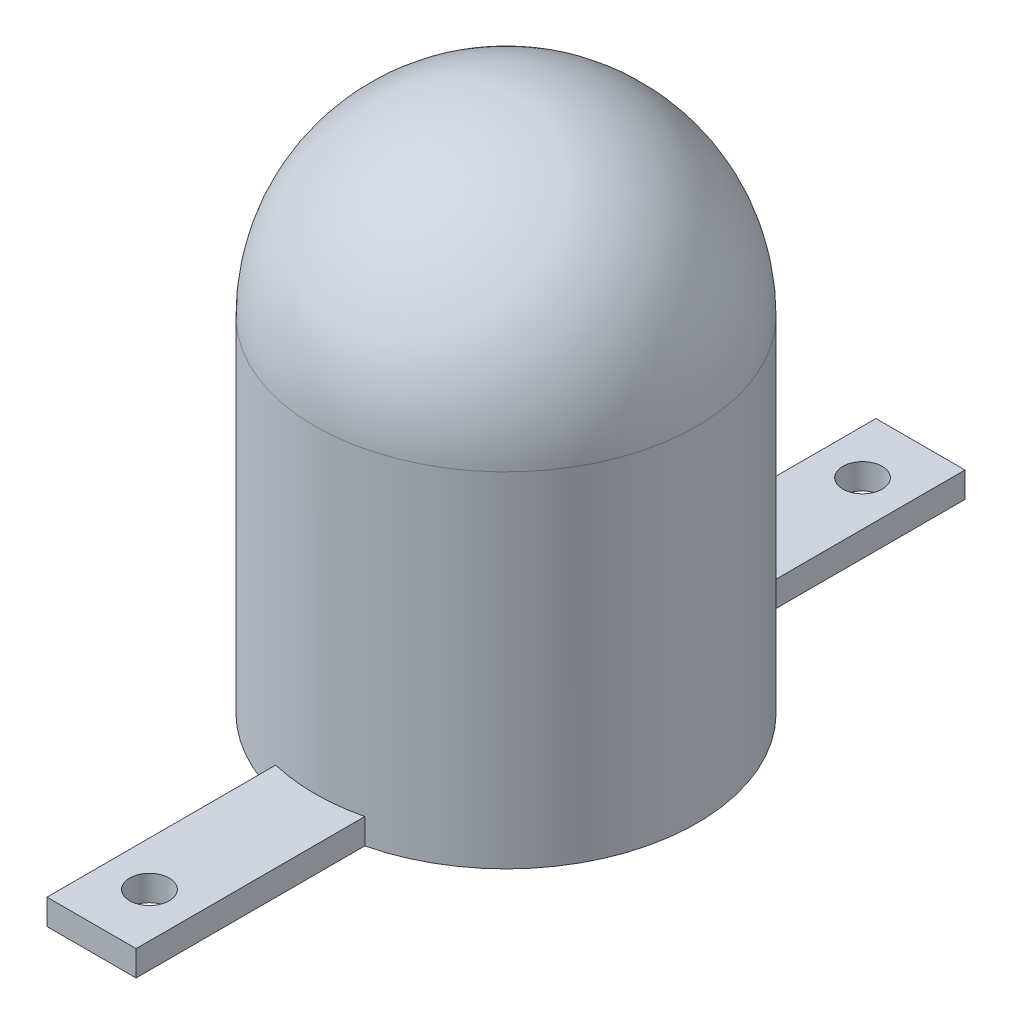
ISO-10303-21;
HEADER;
FILE_DESCRIPTION(('STEP AP214'),'2;1');
FILE_NAME('part.step','',(''),(''),'','','');
FILE_SCHEMA(('AUTOMOTIVE_DESIGN { 1 0 10303 214 1 1 1 1 }'));
ENDSEC;
DATA;
#1=APPLICATION_CONTEXT('core data for automotive mechanical design processes');
#2=APPLICATION_PROTOCOL_DEFINITION('international standard','automotive_design',2000,#1);
#3=PRODUCT_CONTEXT('',#1,'mechanical');
#4=PRODUCT('Part','Part','',(#3));
#5=PRODUCT_RELATED_PRODUCT_CATEGORY('part','',(#4));
#6=PRODUCT_DEFINITION_FORMATION('','',#4);
#7=PRODUCT_DEFINITION_CONTEXT('part definition',#1,'design');
#8=PRODUCT_DEFINITION('design','',#6,#7);
#9=PRODUCT_DEFINITION_SHAPE('','',#8);
#10=(LENGTH_UNIT() NAMED_UNIT(*) SI_UNIT(.MILLI.,.METRE.));
#11=(NAMED_UNIT(*) PLANE_ANGLE_UNIT() SI_UNIT($,.RADIAN.));
#12=(NAMED_UNIT(*) SI_UNIT($,.STERADIAN.) SOLID_ANGLE_UNIT());
#13=UNCERTAINTY_MEASURE_WITH_UNIT(LENGTH_MEASURE(1.E-05),#10,'distance_accuracy_value','');
#14=(GEOMETRIC_REPRESENTATION_CONTEXT(3) GLOBAL_UNCERTAINTY_ASSIGNED_CONTEXT((#13)) GLOBAL_UNIT_ASSIGNED_CONTEXT((#10,
#11,#12)) REPRESENTATION_CONTEXT('',''));
#15=CARTESIAN_POINT('',(0.,0.,0.));
#16=DIRECTION('',(0.,0.,1.));
#17=DIRECTION('',(1.,0.,0.));
#18=AXIS2_PLACEMENT_3D('',#15,#16,#17);
#19=CARTESIAN_POINT('',(-3.50000000000001,2.,-32.55));
#20=DIRECTION('',(1.,0.,0.));
#21=DIRECTION('',(0.,0.,-1.));
#22=AXIS2_PLACEMENT_3D('',#19,#20,#21);
#23=PLANE('',#22);
#24=DIRECTION('',(0.,1.,0.));
#25=VECTOR('',#24,1.);
#26=CARTESIAN_POINT('',(-3.5,-1.04083408558608E-13,-14.5859521458149));
#27=LINE('',#26,#25);
#28=CARTESIAN_POINT('',(-3.5,2.,-14.5859521458149));
#29=VERTEX_POINT('',#28);
#30=CARTESIAN_POINT('',(-3.5,-1.2852377793051E-13,-14.5859521458149));
#31=VERTEX_POINT('',#30);
#32=EDGE_CURVE('E150',#29,#31,#27,.F.);
#33=ORIENTED_EDGE('',*,*,#32,.F.);
#34=DIRECTION('',(0.,0.,1.));
#35=VECTOR('',#34,1.);
#36=CARTESIAN_POINT('',(-3.50000000000001,2.,-32.55));
#37=LINE('',#36,#35);
#38=CARTESIAN_POINT('',(-3.50000000000001,2.,-32.55));
#39=VERTEX_POINT('',#38);
#40=EDGE_CURVE('E158',#39,#29,#37,.T.);
#41=ORIENTED_EDGE('',*,*,#40,.F.);
#42=DIRECTION('',(0.,-1.,0.));
#43=VECTOR('',#42,1.);
#44=CARTESIAN_POINT('',(-3.50000000000001,2.,-32.55));
#45=LINE('',#44,#43);
#46=CARTESIAN_POINT('',(-3.50000000000001,0.,-32.55));
#47=VERTEX_POINT('',#46);
#48=EDGE_CURVE('E136',#39,#47,#45,.T.);
#49=ORIENTED_EDGE('',*,*,#48,.T.);
#50=DIRECTION('',(0.,0.,1.));
#51=VECTOR('',#50,1.);
#52=CARTESIAN_POINT('',(-3.50000000000001,0.,-32.55));
#53=LINE('',#52,#51);
#54=EDGE_CURVE('E146',#47,#31,#53,.T.);
#55=ORIENTED_EDGE('',*,*,#54,.T.);
#56=EDGE_LOOP('',(#33,#41,#49,#55));
#57=FACE_BOUND('',#56,.T.);
#58=ADVANCED_FACE('F33',(#57),#23,.F.);
#59=DIRECTION('',(0.,1.,0.));
#60=VECTOR('',#59,1.);
#61=CARTESIAN_POINT('',(-3.5,-1.04083408558608E-13,14.5859521458149));
#62=LINE('',#61,#60);
#63=CARTESIAN_POINT('',(-3.5,-1.2852377793051E-13,14.5859521458149));
#64=VERTEX_POINT('',#63);
#65=CARTESIAN_POINT('',(-3.5,2.,14.5859521458149));
#66=VERTEX_POINT('',#65);
#67=EDGE_CURVE('E47',#64,#66,#62,.T.);
#68=ORIENTED_EDGE('',*,*,#67,.F.);
#69=CARTESIAN_POINT('',(-3.5,0.,32.55));
#70=VERTEX_POINT('',#69);
#71=EDGE_CURVE('E149',#64,#70,#53,.T.);
#72=ORIENTED_EDGE('',*,*,#71,.T.);
#73=DIRECTION('',(0.,-1.,0.));
#74=VECTOR('',#73,1.);
#75=CARTESIAN_POINT('',(-3.5,2.,32.55));
#76=LINE('',#75,#74);
#77=CARTESIAN_POINT('',(-3.5,2.,32.55));
#78=VERTEX_POINT('',#77);
#79=EDGE_CURVE('E11',#78,#70,#76,.T.);
#80=ORIENTED_EDGE('',*,*,#79,.F.);
#81=EDGE_CURVE('E84',#66,#78,#37,.T.);
#82=ORIENTED_EDGE('',*,*,#81,.F.);
#83=EDGE_LOOP('',(#68,#72,#80,#82));
#84=FACE_BOUND('',#83,.T.);
#85=ADVANCED_FACE('F202',(#84),#23,.F.);
#86=CARTESIAN_POINT('',(3.49999999999999,2.,-32.55));
#87=DIRECTION('',(-1.,0.,0.));
#88=DIRECTION('',(0.,0.,1.));
#89=AXIS2_PLACEMENT_3D('',#86,#87,#88);
#90=PLANE('',#89);
#91=DIRECTION('',(0.,1.,0.));
#92=VECTOR('',#91,1.);
#93=CARTESIAN_POINT('',(3.5,-1.04083408558608E-13,14.5859521458149));
#94=LINE('',#93,#92);
#95=CARTESIAN_POINT('',(3.5,2.,14.5859521458149));
#96=VERTEX_POINT('',#95);
#97=CARTESIAN_POINT('',(3.5,0.,14.5859521458149));
#98=VERTEX_POINT('',#97);
#99=EDGE_CURVE('E105',#96,#98,#94,.F.);
#100=ORIENTED_EDGE('',*,*,#99,.F.);
#101=DIRECTION('',(0.,0.,-1.));
#102=VECTOR('',#101,1.);
#103=CARTESIAN_POINT('',(3.49999999999999,2.,-32.55));
#104=LINE('',#103,#102);
#105=CARTESIAN_POINT('',(3.5,2.,32.55));
#106=VERTEX_POINT('',#105);
#107=EDGE_CURVE('E153',#106,#96,#104,.T.);
#108=ORIENTED_EDGE('',*,*,#107,.F.);
#109=DIRECTION('',(0.,-1.,0.));
#110=VECTOR('',#109,1.);
#111=CARTESIAN_POINT('',(3.5,2.,32.55));
#112=LINE('',#111,#110);
#113=CARTESIAN_POINT('',(3.5,0.,32.55));
#114=VERTEX_POINT('',#113);
#115=EDGE_CURVE('E40',#106,#114,#112,.T.);
#116=ORIENTED_EDGE('',*,*,#115,.T.);
#117=DIRECTION('',(0.,0.,-1.));
#118=VECTOR('',#117,1.);
#119=CARTESIAN_POINT('',(3.49999999999999,0.,-32.55));
#120=LINE('',#119,#118);
#121=EDGE_CURVE('E122',#114,#98,#120,.T.);
#122=ORIENTED_EDGE('',*,*,#121,.T.);
#123=EDGE_LOOP('',(#100,#108,#116,#122));
#124=FACE_BOUND('',#123,.T.);
#125=ADVANCED_FACE('F128',(#124),#90,.F.);
#126=DIRECTION('',(0.,1.,0.));
#127=VECTOR('',#126,1.);
#128=CARTESIAN_POINT('',(3.5,-1.04083408558608E-13,-14.5859521458149));
#129=LINE('',#128,#127);
#130=CARTESIAN_POINT('',(3.5,0.,-14.5859521458149));
#131=VERTEX_POINT('',#130);
#132=CARTESIAN_POINT('',(3.5,2.,-14.5859521458149));
#133=VERTEX_POINT('',#132);
#134=EDGE_CURVE('E161',#131,#133,#129,.T.);
#135=ORIENTED_EDGE('',*,*,#134,.F.);
#136=CARTESIAN_POINT('',(3.49999999999999,0.,-32.55));
#137=VERTEX_POINT('',#136);
#138=EDGE_CURVE('E123',#131,#137,#120,.T.);
#139=ORIENTED_EDGE('',*,*,#138,.T.);
#140=DIRECTION('',(0.,-1.,0.));
#141=VECTOR('',#140,1.);
#142=CARTESIAN_POINT('',(3.49999999999999,2.,-32.55));
#143=LINE('',#142,#141);
#144=CARTESIAN_POINT('',(3.49999999999999,2.,-32.55));
#145=VERTEX_POINT('',#144);
#146=EDGE_CURVE('E138',#145,#137,#143,.T.);
#147=ORIENTED_EDGE('',*,*,#146,.F.);
#148=EDGE_CURVE('E155',#133,#145,#104,.T.);
#149=ORIENTED_EDGE('',*,*,#148,.F.);
#150=EDGE_LOOP('',(#135,#139,#147,#149));
#151=FACE_BOUND('',#150,.T.);
#152=ADVANCED_FACE('F193',(#151),#90,.F.);
#153=CARTESIAN_POINT('',(0.,2.,0.));
#154=DIRECTION('',(0.,1.,0.));
#155=DIRECTION('',(0.,0.,1.));
#156=AXIS2_PLACEMENT_3D('',#153,#154,#155);
#157=PLANE('',#156);
#158=CARTESIAN_POINT('',(0.,2.,-28.));
#159=DIRECTION('',(0.,1.,0.));
#160=DIRECTION('',(0.,0.,-1.));
#161=AXIS2_PLACEMENT_3D('',#158,#159,#160);
#162=CIRCLE('',#161,1.55);
#163=CARTESIAN_POINT('',(0.,2.,-29.55));
#164=VERTEX_POINT('',#163);
#165=EDGE_CURVE('E175',#164,#164,#162,.T.);
#166=ORIENTED_EDGE('',*,*,#165,.F.);
#167=EDGE_LOOP('',(#166));
#168=FACE_BOUND('',#167,.T.);
#169=ORIENTED_EDGE('',*,*,#40,.T.);
#170=CARTESIAN_POINT('',(0.,2.,0.));
#171=DIRECTION('',(0.,1.,0.));
#172=DIRECTION('',(0.,0.,1.));
#173=AXIS2_PLACEMENT_3D('',#170,#171,#172);
#174=CIRCLE('',#173,15.0000000000001);
#175=EDGE_CURVE('E163',#29,#133,#174,.F.);
#176=ORIENTED_EDGE('',*,*,#175,.T.);
#177=ORIENTED_EDGE('',*,*,#148,.T.);
#178=DIRECTION('',(-1.,0.,0.));
#179=VECTOR('',#178,1.);
#180=CARTESIAN_POINT('',(-3.50000000000001,2.,-32.55));
#181=LINE('',#180,#179);
#182=EDGE_CURVE('E56',#145,#39,#181,.T.);
#183=ORIENTED_EDGE('',*,*,#182,.T.);
#184=EDGE_LOOP('',(#169,#176,#177,#183));
#185=FACE_BOUND('',#184,.T.);
#186=ADVANCED_FACE('F190',(#168,#185),#157,.T.);
#187=CARTESIAN_POINT('',(0.,2.,28.));
#188=DIRECTION('',(0.,1.,0.));
#189=DIRECTION('',(0.,0.,1.));
#190=AXIS2_PLACEMENT_3D('',#187,#188,#189);
#191=CIRCLE('',#190,1.55);
#192=CARTESIAN_POINT('',(0.,2.,29.55));
#193=VERTEX_POINT('',#192);
#194=EDGE_CURVE('E169',#193,#193,#191,.T.);
#195=ORIENTED_EDGE('',*,*,#194,.F.);
#196=EDGE_LOOP('',(#195));
#197=FACE_BOUND('',#196,.T.);
#198=ORIENTED_EDGE('',*,*,#107,.T.);
#199=EDGE_CURVE('E110',#96,#66,#174,.F.);
#200=ORIENTED_EDGE('',*,*,#199,.T.);
#201=ORIENTED_EDGE('',*,*,#81,.T.);
#202=DIRECTION('',(1.,0.,0.));
#203=VECTOR('',#202,1.);
#204=CARTESIAN_POINT('',(-3.5,2.,32.55));
#205=LINE('',#204,#203);
#206=EDGE_CURVE('E156',#78,#106,#205,.T.);
#207=ORIENTED_EDGE('',*,*,#206,.T.);
#208=EDGE_LOOP('',(#198,#200,#201,#207));
#209=FACE_BOUND('',#208,.T.);
#210=ADVANCED_FACE('F192',(#197,#209),#157,.T.);
#211=CARTESIAN_POINT('',(-3.5,2.,32.55));
#212=DIRECTION('',(0.,0.,-1.));
#213=DIRECTION('',(-1.,0.,0.));
#214=AXIS2_PLACEMENT_3D('',#211,#212,#213);
#215=PLANE('',#214);
#216=DIRECTION('',(1.,0.,0.));
#217=VECTOR('',#216,1.);
#218=CARTESIAN_POINT('',(-3.5,0.,32.55));
#219=LINE('',#218,#217);
#220=EDGE_CURVE('E132',#70,#114,#219,.T.);
#221=ORIENTED_EDGE('',*,*,#220,.T.);
#222=ORIENTED_EDGE('',*,*,#115,.F.);
#223=ORIENTED_EDGE('',*,*,#206,.F.);
#224=ORIENTED_EDGE('',*,*,#79,.T.);
#225=EDGE_LOOP('',(#221,#222,#223,#224));
#226=FACE_BOUND('',#225,.T.);
#227=ADVANCED_FACE('F213',(#226),#215,.F.);
#228=CARTESIAN_POINT('',(-3.50000000000001,2.,-32.55));
#229=DIRECTION('',(0.,0.,1.));
#230=DIRECTION('',(1.,0.,0.));
#231=AXIS2_PLACEMENT_3D('',#228,#229,#230);
#232=PLANE('',#231);
#233=DIRECTION('',(-1.,0.,0.));
#234=VECTOR('',#233,1.);
#235=CARTESIAN_POINT('',(-3.50000000000001,0.,-32.55));
#236=LINE('',#235,#234);
#237=EDGE_CURVE('E77',#137,#47,#236,.T.);
#238=ORIENTED_EDGE('',*,*,#237,.T.);
#239=ORIENTED_EDGE('',*,*,#48,.F.);
#240=ORIENTED_EDGE('',*,*,#182,.F.);
#241=ORIENTED_EDGE('',*,*,#146,.T.);
#242=EDGE_LOOP('',(#238,#239,#240,#241));
#243=FACE_BOUND('',#242,.T.);
#244=ADVANCED_FACE('F140',(#243),#232,.F.);
#245=CARTESIAN_POINT('',(0.,0.,0.));
#246=DIRECTION('',(0.,1.,0.));
#247=DIRECTION('',(0.,0.,1.));
#248=AXIS2_PLACEMENT_3D('',#245,#246,#247);
#249=PLANE('',#248);
#250=CARTESIAN_POINT('',(0.,0.,-28.));
#251=DIRECTION('',(0.,1.,0.));
#252=DIRECTION('',(0.,0.,-1.));
#253=AXIS2_PLACEMENT_3D('',#250,#251,#252);
#254=CIRCLE('',#253,1.55);
#255=CARTESIAN_POINT('',(0.,0.,-29.55));
#256=VERTEX_POINT('',#255);
#257=EDGE_CURVE('E172',#256,#256,#254,.T.);
#258=ORIENTED_EDGE('',*,*,#257,.T.);
#259=EDGE_LOOP('',(#258));
#260=FACE_BOUND('',#259,.T.);
#261=CARTESIAN_POINT('',(0.,0.,28.));
#262=DIRECTION('',(0.,1.,0.));
#263=DIRECTION('',(0.,0.,1.));
#264=AXIS2_PLACEMENT_3D('',#261,#262,#263);
#265=CIRCLE('',#264,1.55);
#266=CARTESIAN_POINT('',(0.,0.,29.55));
#267=VERTEX_POINT('',#266);
#268=EDGE_CURVE('E168',#267,#267,#265,.T.);
#269=ORIENTED_EDGE('',*,*,#268,.T.);
#270=EDGE_LOOP('',(#269));
#271=FACE_BOUND('',#270,.T.);
#272=ORIENTED_EDGE('',*,*,#71,.F.);
#273=CARTESIAN_POINT('',(0.,-1.04083408558608E-13,0.));
#274=DIRECTION('',(0.,-1.,0.));
#275=DIRECTION('',(1.,0.,0.));
#276=AXIS2_PLACEMENT_3D('',#273,#274,#275);
#277=CIRCLE('',#276,15.0000000000001);
#278=EDGE_CURVE('E124',#64,#31,#277,.T.);
#279=ORIENTED_EDGE('',*,*,#278,.T.);
#280=ORIENTED_EDGE('',*,*,#54,.F.);
#281=ORIENTED_EDGE('',*,*,#237,.F.);
#282=ORIENTED_EDGE('',*,*,#138,.F.);
#283=EDGE_CURVE('E108',#131,#98,#277,.T.);
#284=ORIENTED_EDGE('',*,*,#283,.T.);
#285=ORIENTED_EDGE('',*,*,#121,.F.);
#286=ORIENTED_EDGE('',*,*,#220,.F.);
#287=EDGE_LOOP('',(#272,#279,#280,#281,#282,#284,#285,#286));
#288=FACE_BOUND('',#287,.T.);
#289=ADVANCED_FACE('F120',(#260,#271,#288),#249,.F.);
#290=CARTESIAN_POINT('',(0.,-1.04083408558608E-13,0.));
#291=DIRECTION('',(0.,1.,0.));
#292=DIRECTION('',(-1.,0.,0.));
#293=AXIS2_PLACEMENT_3D('',#290,#291,#292);
#294=CYLINDRICAL_SURFACE('',#293,15.0000000000001);
#295=CARTESIAN_POINT('',(0.,27.,0.));
#296=DIRECTION('',(0.,-1.,0.));
#297=DIRECTION('',(0.,0.,1.));
#298=AXIS2_PLACEMENT_3D('',#295,#296,#297);
#299=CIRCLE('',#298,15.);
#300=CARTESIAN_POINT('',(0.,27.,15.));
#301=VERTEX_POINT('',#300);
#302=EDGE_CURVE('E125',#301,#301,#299,.T.);
#303=ORIENTED_EDGE('',*,*,#302,.T.);
#304=EDGE_LOOP('',(#303));
#305=FACE_BOUND('',#304,.T.);
#306=ORIENTED_EDGE('',*,*,#175,.F.);
#307=ORIENTED_EDGE('',*,*,#32,.T.);
#308=ORIENTED_EDGE('',*,*,#278,.F.);
#309=ORIENTED_EDGE('',*,*,#67,.T.);
#310=ORIENTED_EDGE('',*,*,#199,.F.);
#311=ORIENTED_EDGE('',*,*,#99,.T.);
#312=ORIENTED_EDGE('',*,*,#283,.F.);
#313=ORIENTED_EDGE('',*,*,#134,.T.);
#314=EDGE_LOOP('',(#306,#307,#308,#309,#310,#311,#312,#313));
#315=FACE_BOUND('',#314,.T.);
#316=ADVANCED_FACE('F107',(#305,#315),#294,.T.);
#317=CARTESIAN_POINT('',(0.,27.,0.));
#318=DIRECTION('',(0.,0.,-1.));
#319=DIRECTION('',(-1.,0.,0.));
#320=AXIS2_PLACEMENT_3D('',#317,#318,#319);
#321=SPHERICAL_SURFACE('',#320,15.);
#322=CARTESIAN_POINT('',(0.,27.,0.));
#323=DIRECTION('',(0.,-1.,0.));
#324=DIRECTION('',(0.,0.,1.));
#325=AXIS2_PLACEMENT_3D('',#322,#323,#324);
#326=SPHERICAL_SURFACE('',#325,15.);
#327=ORIENTED_EDGE('',*,*,#302,.F.);
#328=EDGE_LOOP('',(#327));
#329=FACE_BOUND('',#328,.T.);
#330=ADVANCED_FACE('F240',(#329),#326,.T.);
#331=CARTESIAN_POINT('',(0.,0.,28.));
#332=DIRECTION('',(0.,1.,0.));
#333=DIRECTION('',(0.,0.,1.));
#334=AXIS2_PLACEMENT_3D('',#331,#332,#333);
#335=CYLINDRICAL_SURFACE('',#334,1.55);
#336=ORIENTED_EDGE('',*,*,#268,.F.);
#337=EDGE_LOOP('',(#336));
#338=FACE_BOUND('',#337,.T.);
#339=ORIENTED_EDGE('',*,*,#194,.T.);
#340=EDGE_LOOP('',(#339));
#341=FACE_BOUND('',#340,.T.);
#342=ADVANCED_FACE('F186',(#338,#341),#335,.F.);
#343=CARTESIAN_POINT('',(0.,0.,-28.));
#344=DIRECTION('',(0.,1.,0.));
#345=DIRECTION('',(0.,0.,1.));
#346=AXIS2_PLACEMENT_3D('',#343,#344,#345);
#347=CYLINDRICAL_SURFACE('',#346,1.55);
#348=ORIENTED_EDGE('',*,*,#257,.F.);
#349=EDGE_LOOP('',(#348));
#350=FACE_BOUND('',#349,.T.);
#351=ORIENTED_EDGE('',*,*,#165,.T.);
#352=EDGE_LOOP('',(#351));
#353=FACE_BOUND('',#352,.T.);
#354=ADVANCED_FACE('F183',(#350,#353),#347,.F.);
#355=CLOSED_SHELL('',(#58,#85,#125,#152,#186,#210,#227,#244,#289,#316,#330,#342,#354));
#356=MANIFOLD_SOLID_BREP('B2',#355);
#357=ADVANCED_BREP_SHAPE_REPRESENTATION('',(#18,#356),#14);
#358=SHAPE_DEFINITION_REPRESENTATION(#9,#357);
ENDSEC;
END-ISO-10303-21;
